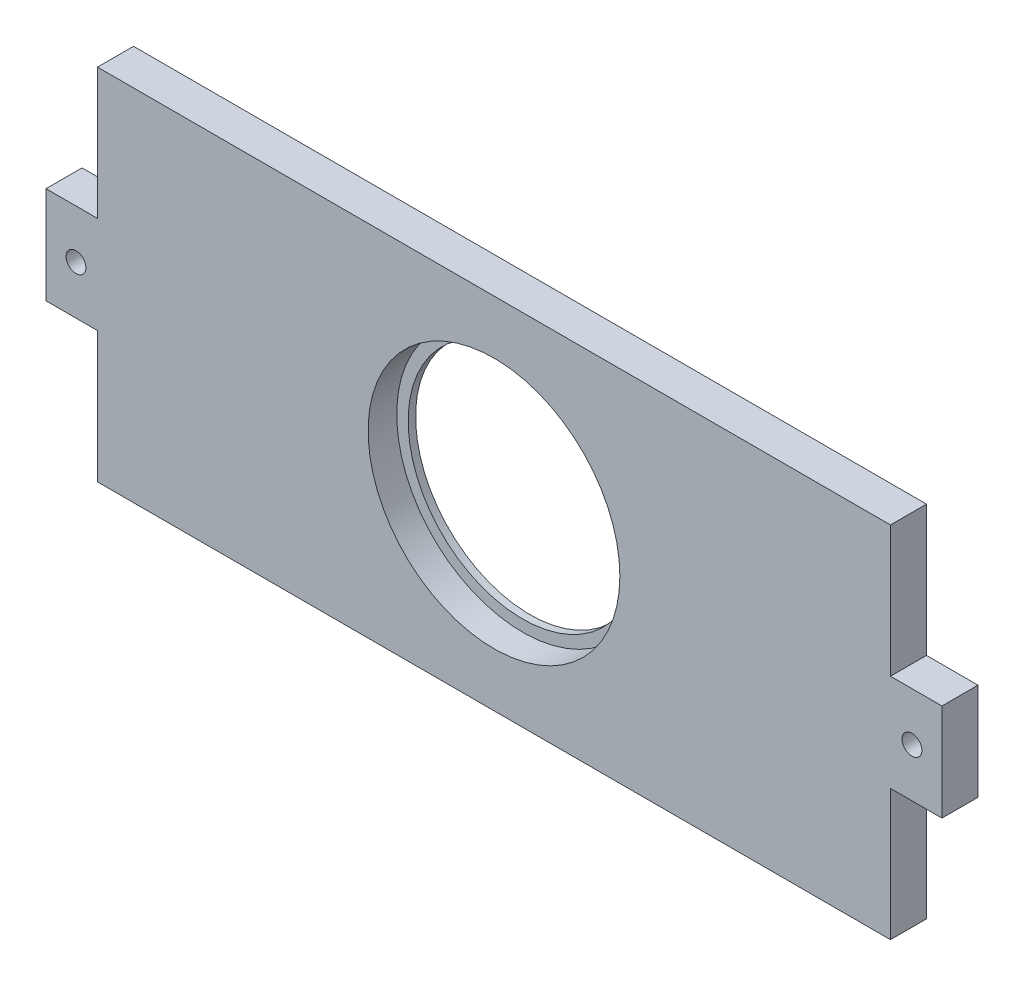
ISO-10303-21;
HEADER;
FILE_DESCRIPTION(('STEP AP214'),'2;1');
FILE_NAME('part.step','',(''),(''),'','','');
FILE_SCHEMA(('AUTOMOTIVE_DESIGN { 1 0 10303 214 1 1 1 1 }'));
ENDSEC;
DATA;
#1=APPLICATION_CONTEXT('core data for automotive mechanical design processes');
#2=APPLICATION_PROTOCOL_DEFINITION('international standard','automotive_design',2000,#1);
#3=PRODUCT_CONTEXT('',#1,'mechanical');
#4=PRODUCT('Part','Part','',(#3));
#5=PRODUCT_RELATED_PRODUCT_CATEGORY('part','',(#4));
#6=PRODUCT_DEFINITION_FORMATION('','',#4);
#7=PRODUCT_DEFINITION_CONTEXT('part definition',#1,'design');
#8=PRODUCT_DEFINITION('design','',#6,#7);
#9=PRODUCT_DEFINITION_SHAPE('','',#8);
#10=(LENGTH_UNIT() NAMED_UNIT(*) SI_UNIT(.MILLI.,.METRE.));
#11=(NAMED_UNIT(*) PLANE_ANGLE_UNIT() SI_UNIT($,.RADIAN.));
#12=(NAMED_UNIT(*) SI_UNIT($,.STERADIAN.) SOLID_ANGLE_UNIT());
#13=UNCERTAINTY_MEASURE_WITH_UNIT(LENGTH_MEASURE(1.E-05),#10,'distance_accuracy_value','');
#14=(GEOMETRIC_REPRESENTATION_CONTEXT(3) GLOBAL_UNCERTAINTY_ASSIGNED_CONTEXT((#13)) GLOBAL_UNIT_ASSIGNED_CONTEXT((#10,
#11,#12)) REPRESENTATION_CONTEXT('',''));
#15=CARTESIAN_POINT('',(0.,0.,0.));
#16=DIRECTION('',(0.,0.,1.));
#17=DIRECTION('',(1.,0.,0.));
#18=AXIS2_PLACEMENT_3D('',#15,#16,#17);
#19=CARTESIAN_POINT('',(0.,0.,4.));
#20=DIRECTION('',(0.,0.,-1.));
#21=DIRECTION('',(-1.,0.,0.));
#22=AXIS2_PLACEMENT_3D('',#19,#20,#21);
#23=CYLINDRICAL_SURFACE('',#22,12.7);
#24=CARTESIAN_POINT('',(0.,0.,0.));
#25=DIRECTION('',(0.,0.,1.));
#26=DIRECTION('',(1.,0.,0.));
#27=AXIS2_PLACEMENT_3D('',#24,#25,#26);
#28=CIRCLE('',#27,12.7);
#29=CARTESIAN_POINT('',(12.7,0.,0.));
#30=VERTEX_POINT('',#29);
#31=EDGE_CURVE('E160',#30,#30,#28,.T.);
#32=ORIENTED_EDGE('',*,*,#31,.F.);
#33=EDGE_LOOP('',(#32));
#34=FACE_BOUND('',#33,.T.);
#35=CARTESIAN_POINT('',(0.,0.,0.825));
#36=DIRECTION('',(0.,0.,1.));
#37=DIRECTION('',(1.,0.,0.));
#38=AXIS2_PLACEMENT_3D('',#35,#36,#37);
#39=CIRCLE('',#38,12.7);
#40=CARTESIAN_POINT('',(12.7,0.,0.825));
#41=VERTEX_POINT('',#40);
#42=EDGE_CURVE('E37',#41,#41,#39,.T.);
#43=ORIENTED_EDGE('',*,*,#42,.T.);
#44=EDGE_LOOP('',(#43));
#45=FACE_BOUND('',#44,.T.);
#46=ADVANCED_FACE('F33',(#34,#45),#23,.F.);
#47=CARTESIAN_POINT('',(0.,0.,4.));
#48=DIRECTION('',(0.,0.,1.));
#49=DIRECTION('',(1.,0.,0.));
#50=AXIS2_PLACEMENT_3D('',#47,#48,#49);
#51=PLANE('',#50);
#52=CARTESIAN_POINT('',(0.,0.,4.));
#53=DIRECTION('',(0.,0.,1.));
#54=DIRECTION('',(1.,0.,0.));
#55=AXIS2_PLACEMENT_3D('',#52,#53,#54);
#56=CIRCLE('',#55,13.97);
#57=CARTESIAN_POINT('',(13.97,0.,4.));
#58=VERTEX_POINT('',#57);
#59=EDGE_CURVE('E302',#58,#58,#56,.T.);
#60=ORIENTED_EDGE('',*,*,#59,.F.);
#61=EDGE_LOOP('',(#60));
#62=FACE_BOUND('',#61,.T.);
#63=CARTESIAN_POINT('',(-46.3876,0.,4.));
#64=DIRECTION('',(0.,0.,1.));
#65=DIRECTION('',(1.,0.,0.));
#66=AXIS2_PLACEMENT_3D('',#63,#64,#65);
#67=CIRCLE('',#66,1.1);
#68=CARTESIAN_POINT('',(-45.2876,0.,4.));
#69=VERTEX_POINT('',#68);
#70=EDGE_CURVE('E282',#69,#69,#67,.T.);
#71=ORIENTED_EDGE('',*,*,#70,.F.);
#72=EDGE_LOOP('',(#71));
#73=FACE_BOUND('',#72,.T.);
#74=DIRECTION('',(-1.,0.,0.));
#75=VECTOR('',#74,1.);
#76=CARTESIAN_POINT('',(44.,19.9319,4.));
#77=LINE('',#76,#75);
#78=CARTESIAN_POINT('',(44.,19.9319,4.));
#79=VERTEX_POINT('',#78);
#80=CARTESIAN_POINT('',(-44.,19.9319,4.));
#81=VERTEX_POINT('',#80);
#82=EDGE_CURVE('E179',#79,#81,#77,.T.);
#83=ORIENTED_EDGE('',*,*,#82,.T.);
#84=DIRECTION('',(0.,-1.,0.));
#85=VECTOR('',#84,1.);
#86=CARTESIAN_POINT('',(-44.,19.9319,4.));
#87=LINE('',#86,#85);
#88=CARTESIAN_POINT('',(-44.,5.39,4.));
#89=VERTEX_POINT('',#88);
#90=EDGE_CURVE('E106',#81,#89,#87,.T.);
#91=ORIENTED_EDGE('',*,*,#90,.T.);
#92=DIRECTION('',(-1.,0.,0.));
#93=VECTOR('',#92,1.);
#94=CARTESIAN_POINT('',(-44.,5.39,4.));
#95=LINE('',#94,#93);
#96=CARTESIAN_POINT('',(-49.715,5.39,4.));
#97=VERTEX_POINT('',#96);
#98=EDGE_CURVE('E207',#89,#97,#95,.T.);
#99=ORIENTED_EDGE('',*,*,#98,.T.);
#100=DIRECTION('',(0.,-1.,0.));
#101=VECTOR('',#100,1.);
#102=CARTESIAN_POINT('',(-49.715,5.39,4.));
#103=LINE('',#102,#101);
#104=CARTESIAN_POINT('',(-49.715,-5.39,4.));
#105=VERTEX_POINT('',#104);
#106=EDGE_CURVE('E226',#97,#105,#103,.T.);
#107=ORIENTED_EDGE('',*,*,#106,.T.);
#108=DIRECTION('',(1.,0.,0.));
#109=VECTOR('',#108,1.);
#110=CARTESIAN_POINT('',(-44.,-5.39,4.));
#111=LINE('',#110,#109);
#112=CARTESIAN_POINT('',(-44.,-5.39,4.));
#113=VERTEX_POINT('',#112);
#114=EDGE_CURVE('E223',#105,#113,#111,.T.);
#115=ORIENTED_EDGE('',*,*,#114,.T.);
#116=DIRECTION('',(0.,-1.,0.));
#117=VECTOR('',#116,1.);
#118=CARTESIAN_POINT('',(-44.,-19.9319,4.));
#119=LINE('',#118,#117);
#120=CARTESIAN_POINT('',(-44.,-19.9319,4.));
#121=VERTEX_POINT('',#120);
#122=EDGE_CURVE('E225',#113,#121,#119,.T.);
#123=ORIENTED_EDGE('',*,*,#122,.T.);
#124=DIRECTION('',(1.,0.,0.));
#125=VECTOR('',#124,1.);
#126=CARTESIAN_POINT('',(44.,-19.9319,4.));
#127=LINE('',#126,#125);
#128=CARTESIAN_POINT('',(44.,-19.9319,4.));
#129=VERTEX_POINT('',#128);
#130=EDGE_CURVE('E228',#121,#129,#127,.T.);
#131=ORIENTED_EDGE('',*,*,#130,.T.);
#132=DIRECTION('',(0.,1.,0.));
#133=VECTOR('',#132,1.);
#134=CARTESIAN_POINT('',(44.,-19.9319,4.));
#135=LINE('',#134,#133);
#136=CARTESIAN_POINT('',(44.,-5.39,4.));
#137=VERTEX_POINT('',#136);
#138=EDGE_CURVE('E234',#129,#137,#135,.T.);
#139=ORIENTED_EDGE('',*,*,#138,.T.);
#140=DIRECTION('',(1.,0.,0.));
#141=VECTOR('',#140,1.);
#142=CARTESIAN_POINT('',(44.,-5.39,4.));
#143=LINE('',#142,#141);
#144=CARTESIAN_POINT('',(49.715,-5.39,4.));
#145=VERTEX_POINT('',#144);
#146=EDGE_CURVE('E138',#137,#145,#143,.T.);
#147=ORIENTED_EDGE('',*,*,#146,.T.);
#148=DIRECTION('',(0.,1.,0.));
#149=VECTOR('',#148,1.);
#150=CARTESIAN_POINT('',(49.715,5.39,4.));
#151=LINE('',#150,#149);
#152=CARTESIAN_POINT('',(49.715,5.39,4.));
#153=VERTEX_POINT('',#152);
#154=EDGE_CURVE('E131',#145,#153,#151,.T.);
#155=ORIENTED_EDGE('',*,*,#154,.T.);
#156=DIRECTION('',(-1.,0.,0.));
#157=VECTOR('',#156,1.);
#158=CARTESIAN_POINT('',(44.,5.39,4.));
#159=LINE('',#158,#157);
#160=CARTESIAN_POINT('',(44.,5.39,4.));
#161=VERTEX_POINT('',#160);
#162=EDGE_CURVE('E136',#153,#161,#159,.T.);
#163=ORIENTED_EDGE('',*,*,#162,.T.);
#164=DIRECTION('',(0.,1.,0.));
#165=VECTOR('',#164,1.);
#166=CARTESIAN_POINT('',(44.,19.9319,4.));
#167=LINE('',#166,#165);
#168=EDGE_CURVE('E51',#161,#79,#167,.T.);
#169=ORIENTED_EDGE('',*,*,#168,.T.);
#170=EDGE_LOOP('',(#83,#91,#99,#107,#115,#123,#131,#139,#147,#155,#163,#169));
#171=FACE_BOUND('',#170,.T.);
#172=CARTESIAN_POINT('',(46.3876,0.,4.));
#173=DIRECTION('',(0.,0.,1.));
#174=DIRECTION('',(-1.,0.,0.));
#175=AXIS2_PLACEMENT_3D('',#172,#173,#174);
#176=CIRCLE('',#175,1.1);
#177=CARTESIAN_POINT('',(45.2876,0.,4.));
#178=VERTEX_POINT('',#177);
#179=EDGE_CURVE('E283',#178,#178,#176,.T.);
#180=ORIENTED_EDGE('',*,*,#179,.F.);
#181=EDGE_LOOP('',(#180));
#182=FACE_BOUND('',#181,.T.);
#183=ADVANCED_FACE('F133',(#62,#73,#171,#182),#51,.T.);
#184=CARTESIAN_POINT('',(0.,0.,0.));
#185=DIRECTION('',(0.,0.,1.));
#186=DIRECTION('',(1.,0.,0.));
#187=AXIS2_PLACEMENT_3D('',#184,#185,#186);
#188=PLANE('',#187);
#189=CARTESIAN_POINT('',(-46.3876,0.,0.));
#190=DIRECTION('',(0.,0.,1.));
#191=DIRECTION('',(1.,0.,0.));
#192=AXIS2_PLACEMENT_3D('',#189,#190,#191);
#193=CIRCLE('',#192,1.1);
#194=CARTESIAN_POINT('',(-45.2876,0.,0.));
#195=VERTEX_POINT('',#194);
#196=EDGE_CURVE('E280',#195,#195,#193,.T.);
#197=ORIENTED_EDGE('',*,*,#196,.T.);
#198=EDGE_LOOP('',(#197));
#199=FACE_BOUND('',#198,.T.);
#200=DIRECTION('',(-1.,0.,0.));
#201=VECTOR('',#200,1.);
#202=CARTESIAN_POINT('',(44.,19.9319,0.));
#203=LINE('',#202,#201);
#204=CARTESIAN_POINT('',(44.,19.9319,0.));
#205=VERTEX_POINT('',#204);
#206=CARTESIAN_POINT('',(-44.,19.9319,0.));
#207=VERTEX_POINT('',#206);
#208=EDGE_CURVE('E156',#205,#207,#203,.T.);
#209=ORIENTED_EDGE('',*,*,#208,.F.);
#210=DIRECTION('',(0.,1.,0.));
#211=VECTOR('',#210,1.);
#212=CARTESIAN_POINT('',(44.,19.9319,0.));
#213=LINE('',#212,#211);
#214=CARTESIAN_POINT('',(44.,5.39,0.));
#215=VERTEX_POINT('',#214);
#216=EDGE_CURVE('E98',#215,#205,#213,.T.);
#217=ORIENTED_EDGE('',*,*,#216,.F.);
#218=DIRECTION('',(-1.,0.,0.));
#219=VECTOR('',#218,1.);
#220=CARTESIAN_POINT('',(44.,5.39,0.));
#221=LINE('',#220,#219);
#222=CARTESIAN_POINT('',(49.715,5.39,0.));
#223=VERTEX_POINT('',#222);
#224=EDGE_CURVE('E92',#223,#215,#221,.T.);
#225=ORIENTED_EDGE('',*,*,#224,.F.);
#226=DIRECTION('',(0.,1.,0.));
#227=VECTOR('',#226,1.);
#228=CARTESIAN_POINT('',(49.715,5.39,0.));
#229=LINE('',#228,#227);
#230=CARTESIAN_POINT('',(49.715,-5.39,0.));
#231=VERTEX_POINT('',#230);
#232=EDGE_CURVE('E146',#231,#223,#229,.T.);
#233=ORIENTED_EDGE('',*,*,#232,.F.);
#234=DIRECTION('',(1.,0.,0.));
#235=VECTOR('',#234,1.);
#236=CARTESIAN_POINT('',(44.,-5.39,0.));
#237=LINE('',#236,#235);
#238=CARTESIAN_POINT('',(44.,-5.39,0.));
#239=VERTEX_POINT('',#238);
#240=EDGE_CURVE('E174',#239,#231,#237,.T.);
#241=ORIENTED_EDGE('',*,*,#240,.F.);
#242=DIRECTION('',(0.,1.,0.));
#243=VECTOR('',#242,1.);
#244=CARTESIAN_POINT('',(44.,-19.9319,0.));
#245=LINE('',#244,#243);
#246=CARTESIAN_POINT('',(44.,-19.9319,0.));
#247=VERTEX_POINT('',#246);
#248=EDGE_CURVE('E172',#247,#239,#245,.T.);
#249=ORIENTED_EDGE('',*,*,#248,.F.);
#250=DIRECTION('',(1.,0.,0.));
#251=VECTOR('',#250,1.);
#252=CARTESIAN_POINT('',(44.,-19.9319,0.));
#253=LINE('',#252,#251);
#254=CARTESIAN_POINT('',(-44.,-19.9319,0.));
#255=VERTEX_POINT('',#254);
#256=EDGE_CURVE('E170',#255,#247,#253,.T.);
#257=ORIENTED_EDGE('',*,*,#256,.F.);
#258=DIRECTION('',(0.,-1.,0.));
#259=VECTOR('',#258,1.);
#260=CARTESIAN_POINT('',(-44.,-19.9319,0.));
#261=LINE('',#260,#259);
#262=CARTESIAN_POINT('',(-44.,-5.39,0.));
#263=VERTEX_POINT('',#262);
#264=EDGE_CURVE('E168',#263,#255,#261,.T.);
#265=ORIENTED_EDGE('',*,*,#264,.F.);
#266=DIRECTION('',(1.,0.,0.));
#267=VECTOR('',#266,1.);
#268=CARTESIAN_POINT('',(-44.,-5.39,0.));
#269=LINE('',#268,#267);
#270=CARTESIAN_POINT('',(-49.715,-5.39,0.));
#271=VERTEX_POINT('',#270);
#272=EDGE_CURVE('E166',#271,#263,#269,.T.);
#273=ORIENTED_EDGE('',*,*,#272,.F.);
#274=DIRECTION('',(0.,-1.,0.));
#275=VECTOR('',#274,1.);
#276=CARTESIAN_POINT('',(-49.715,5.39,0.));
#277=LINE('',#276,#275);
#278=CARTESIAN_POINT('',(-49.715,5.39,0.));
#279=VERTEX_POINT('',#278);
#280=EDGE_CURVE('E164',#279,#271,#277,.T.);
#281=ORIENTED_EDGE('',*,*,#280,.F.);
#282=DIRECTION('',(-1.,0.,0.));
#283=VECTOR('',#282,1.);
#284=CARTESIAN_POINT('',(-44.,5.39,0.));
#285=LINE('',#284,#283);
#286=CARTESIAN_POINT('',(-44.,5.39,0.));
#287=VERTEX_POINT('',#286);
#288=EDGE_CURVE('E162',#287,#279,#285,.T.);
#289=ORIENTED_EDGE('',*,*,#288,.F.);
#290=DIRECTION('',(0.,-1.,0.));
#291=VECTOR('',#290,1.);
#292=CARTESIAN_POINT('',(-44.,19.9319,0.));
#293=LINE('',#292,#291);
#294=EDGE_CURVE('E159',#207,#287,#293,.T.);
#295=ORIENTED_EDGE('',*,*,#294,.F.);
#296=EDGE_LOOP('',(#209,#217,#225,#233,#241,#249,#257,#265,#273,#281,#289,#295));
#297=FACE_BOUND('',#296,.T.);
#298=ORIENTED_EDGE('',*,*,#31,.T.);
#299=EDGE_LOOP('',(#298));
#300=FACE_BOUND('',#299,.T.);
#301=CARTESIAN_POINT('',(46.3876,0.,0.));
#302=DIRECTION('',(0.,0.,1.));
#303=DIRECTION('',(-1.,0.,0.));
#304=AXIS2_PLACEMENT_3D('',#301,#302,#303);
#305=CIRCLE('',#304,1.1);
#306=CARTESIAN_POINT('',(45.2876,0.,0.));
#307=VERTEX_POINT('',#306);
#308=EDGE_CURVE('E288',#307,#307,#305,.T.);
#309=ORIENTED_EDGE('',*,*,#308,.T.);
#310=EDGE_LOOP('',(#309));
#311=FACE_BOUND('',#310,.T.);
#312=ADVANCED_FACE('F211',(#199,#297,#300,#311),#188,.F.);
#313=CARTESIAN_POINT('',(44.,19.9319,4.));
#314=DIRECTION('',(0.,-1.,0.));
#315=DIRECTION('',(1.,0.,0.));
#316=AXIS2_PLACEMENT_3D('',#313,#314,#315);
#317=PLANE('',#316);
#318=ORIENTED_EDGE('',*,*,#208,.T.);
#319=DIRECTION('',(0.,0.,-1.));
#320=VECTOR('',#319,1.);
#321=CARTESIAN_POINT('',(-44.,19.9319,4.));
#322=LINE('',#321,#320);
#323=EDGE_CURVE('E11',#81,#207,#322,.T.);
#324=ORIENTED_EDGE('',*,*,#323,.F.);
#325=ORIENTED_EDGE('',*,*,#82,.F.);
#326=DIRECTION('',(0.,0.,-1.));
#327=VECTOR('',#326,1.);
#328=CARTESIAN_POINT('',(44.,19.9319,4.));
#329=LINE('',#328,#327);
#330=EDGE_CURVE('E152',#79,#205,#329,.T.);
#331=ORIENTED_EDGE('',*,*,#330,.T.);
#332=EDGE_LOOP('',(#318,#324,#325,#331));
#333=FACE_BOUND('',#332,.T.);
#334=ADVANCED_FACE('F35',(#333),#317,.F.);
#335=CARTESIAN_POINT('',(-44.,19.9319,4.));
#336=DIRECTION('',(1.,0.,0.));
#337=DIRECTION('',(0.,0.,-1.));
#338=AXIS2_PLACEMENT_3D('',#335,#336,#337);
#339=PLANE('',#338);
#340=ORIENTED_EDGE('',*,*,#294,.T.);
#341=DIRECTION('',(0.,0.,-1.));
#342=VECTOR('',#341,1.);
#343=CARTESIAN_POINT('',(-44.,5.39,4.));
#344=LINE('',#343,#342);
#345=EDGE_CURVE('E43',#89,#287,#344,.T.);
#346=ORIENTED_EDGE('',*,*,#345,.F.);
#347=ORIENTED_EDGE('',*,*,#90,.F.);
#348=ORIENTED_EDGE('',*,*,#323,.T.);
#349=EDGE_LOOP('',(#340,#346,#347,#348));
#350=FACE_BOUND('',#349,.T.);
#351=ADVANCED_FACE('F277',(#350),#339,.F.);
#352=CARTESIAN_POINT('',(-44.,5.39,4.));
#353=DIRECTION('',(0.,-1.,0.));
#354=DIRECTION('',(1.,0.,0.));
#355=AXIS2_PLACEMENT_3D('',#352,#353,#354);
#356=PLANE('',#355);
#357=ORIENTED_EDGE('',*,*,#288,.T.);
#358=DIRECTION('',(0.,0.,-1.));
#359=VECTOR('',#358,1.);
#360=CARTESIAN_POINT('',(-49.715,5.39,4.));
#361=LINE('',#360,#359);
#362=EDGE_CURVE('E198',#97,#279,#361,.T.);
#363=ORIENTED_EDGE('',*,*,#362,.F.);
#364=ORIENTED_EDGE('',*,*,#98,.F.);
#365=ORIENTED_EDGE('',*,*,#345,.T.);
#366=EDGE_LOOP('',(#357,#363,#364,#365));
#367=FACE_BOUND('',#366,.T.);
#368=ADVANCED_FACE('F205',(#367),#356,.F.);
#369=CARTESIAN_POINT('',(-49.715,5.39,4.));
#370=DIRECTION('',(1.,0.,0.));
#371=DIRECTION('',(0.,0.,-1.));
#372=AXIS2_PLACEMENT_3D('',#369,#370,#371);
#373=PLANE('',#372);
#374=ORIENTED_EDGE('',*,*,#280,.T.);
#375=DIRECTION('',(0.,0.,-1.));
#376=VECTOR('',#375,1.);
#377=CARTESIAN_POINT('',(-49.715,-5.39,4.));
#378=LINE('',#377,#376);
#379=EDGE_CURVE('E195',#105,#271,#378,.T.);
#380=ORIENTED_EDGE('',*,*,#379,.F.);
#381=ORIENTED_EDGE('',*,*,#106,.F.);
#382=ORIENTED_EDGE('',*,*,#362,.T.);
#383=EDGE_LOOP('',(#374,#380,#381,#382));
#384=FACE_BOUND('',#383,.T.);
#385=ADVANCED_FACE('F217',(#384),#373,.F.);
#386=CARTESIAN_POINT('',(-44.,-5.39,4.));
#387=DIRECTION('',(0.,1.,0.));
#388=DIRECTION('',(-1.,0.,0.));
#389=AXIS2_PLACEMENT_3D('',#386,#387,#388);
#390=PLANE('',#389);
#391=ORIENTED_EDGE('',*,*,#272,.T.);
#392=DIRECTION('',(0.,0.,-1.));
#393=VECTOR('',#392,1.);
#394=CARTESIAN_POINT('',(-44.,-5.39,4.));
#395=LINE('',#394,#393);
#396=EDGE_CURVE('E192',#113,#263,#395,.T.);
#397=ORIENTED_EDGE('',*,*,#396,.F.);
#398=ORIENTED_EDGE('',*,*,#114,.F.);
#399=ORIENTED_EDGE('',*,*,#379,.T.);
#400=EDGE_LOOP('',(#391,#397,#398,#399));
#401=FACE_BOUND('',#400,.T.);
#402=ADVANCED_FACE('F221',(#401),#390,.F.);
#403=CARTESIAN_POINT('',(-44.,-19.9319,4.));
#404=DIRECTION('',(1.,0.,0.));
#405=DIRECTION('',(0.,0.,-1.));
#406=AXIS2_PLACEMENT_3D('',#403,#404,#405);
#407=PLANE('',#406);
#408=ORIENTED_EDGE('',*,*,#264,.T.);
#409=DIRECTION('',(0.,0.,-1.));
#410=VECTOR('',#409,1.);
#411=CARTESIAN_POINT('',(-44.,-19.9319,4.));
#412=LINE('',#411,#410);
#413=EDGE_CURVE('E189',#121,#255,#412,.T.);
#414=ORIENTED_EDGE('',*,*,#413,.F.);
#415=ORIENTED_EDGE('',*,*,#122,.F.);
#416=ORIENTED_EDGE('',*,*,#396,.T.);
#417=EDGE_LOOP('',(#408,#414,#415,#416));
#418=FACE_BOUND('',#417,.T.);
#419=ADVANCED_FACE('F375',(#418),#407,.F.);
#420=CARTESIAN_POINT('',(44.,-19.9319,4.));
#421=DIRECTION('',(0.,1.,0.));
#422=DIRECTION('',(-1.,0.,0.));
#423=AXIS2_PLACEMENT_3D('',#420,#421,#422);
#424=PLANE('',#423);
#425=ORIENTED_EDGE('',*,*,#256,.T.);
#426=DIRECTION('',(0.,0.,-1.));
#427=VECTOR('',#426,1.);
#428=CARTESIAN_POINT('',(44.,-19.9319,4.));
#429=LINE('',#428,#427);
#430=EDGE_CURVE('E186',#129,#247,#429,.T.);
#431=ORIENTED_EDGE('',*,*,#430,.F.);
#432=ORIENTED_EDGE('',*,*,#130,.F.);
#433=ORIENTED_EDGE('',*,*,#413,.T.);
#434=EDGE_LOOP('',(#425,#431,#432,#433));
#435=FACE_BOUND('',#434,.T.);
#436=ADVANCED_FACE('F366',(#435),#424,.F.);
#437=CARTESIAN_POINT('',(44.,-19.9319,4.));
#438=DIRECTION('',(-1.,0.,0.));
#439=DIRECTION('',(0.,0.,1.));
#440=AXIS2_PLACEMENT_3D('',#437,#438,#439);
#441=PLANE('',#440);
#442=ORIENTED_EDGE('',*,*,#248,.T.);
#443=DIRECTION('',(0.,0.,-1.));
#444=VECTOR('',#443,1.);
#445=CARTESIAN_POINT('',(44.,-5.39,4.));
#446=LINE('',#445,#444);
#447=EDGE_CURVE('E183',#137,#239,#446,.T.);
#448=ORIENTED_EDGE('',*,*,#447,.F.);
#449=ORIENTED_EDGE('',*,*,#138,.F.);
#450=ORIENTED_EDGE('',*,*,#430,.T.);
#451=EDGE_LOOP('',(#442,#448,#449,#450));
#452=FACE_BOUND('',#451,.T.);
#453=ADVANCED_FACE('F240',(#452),#441,.F.);
#454=CARTESIAN_POINT('',(44.,-5.39,4.));
#455=DIRECTION('',(0.,1.,0.));
#456=DIRECTION('',(-1.,0.,0.));
#457=AXIS2_PLACEMENT_3D('',#454,#455,#456);
#458=PLANE('',#457);
#459=ORIENTED_EDGE('',*,*,#240,.T.);
#460=DIRECTION('',(0.,0.,-1.));
#461=VECTOR('',#460,1.);
#462=CARTESIAN_POINT('',(49.715,-5.39,4.));
#463=LINE('',#462,#461);
#464=EDGE_CURVE('E147',#145,#231,#463,.T.);
#465=ORIENTED_EDGE('',*,*,#464,.F.);
#466=ORIENTED_EDGE('',*,*,#146,.F.);
#467=ORIENTED_EDGE('',*,*,#447,.T.);
#468=EDGE_LOOP('',(#459,#465,#466,#467));
#469=FACE_BOUND('',#468,.T.);
#470=ADVANCED_FACE('F244',(#469),#458,.F.);
#471=CARTESIAN_POINT('',(49.715,5.39,4.));
#472=DIRECTION('',(-1.,0.,0.));
#473=DIRECTION('',(0.,0.,1.));
#474=AXIS2_PLACEMENT_3D('',#471,#472,#473);
#475=PLANE('',#474);
#476=ORIENTED_EDGE('',*,*,#232,.T.);
#477=DIRECTION('',(0.,0.,-1.));
#478=VECTOR('',#477,1.);
#479=CARTESIAN_POINT('',(49.715,5.39,4.));
#480=LINE('',#479,#478);
#481=EDGE_CURVE('E143',#153,#223,#480,.T.);
#482=ORIENTED_EDGE('',*,*,#481,.F.);
#483=ORIENTED_EDGE('',*,*,#154,.F.);
#484=ORIENTED_EDGE('',*,*,#464,.T.);
#485=EDGE_LOOP('',(#476,#482,#483,#484));
#486=FACE_BOUND('',#485,.T.);
#487=ADVANCED_FACE('F144',(#486),#475,.F.);
#488=CARTESIAN_POINT('',(44.,5.39,4.));
#489=DIRECTION('',(0.,-1.,0.));
#490=DIRECTION('',(1.,0.,0.));
#491=AXIS2_PLACEMENT_3D('',#488,#489,#490);
#492=PLANE('',#491);
#493=ORIENTED_EDGE('',*,*,#224,.T.);
#494=DIRECTION('',(0.,0.,-1.));
#495=VECTOR('',#494,1.);
#496=CARTESIAN_POINT('',(44.,5.39,4.));
#497=LINE('',#496,#495);
#498=EDGE_CURVE('E148',#161,#215,#497,.T.);
#499=ORIENTED_EDGE('',*,*,#498,.F.);
#500=ORIENTED_EDGE('',*,*,#162,.F.);
#501=ORIENTED_EDGE('',*,*,#481,.T.);
#502=EDGE_LOOP('',(#493,#499,#500,#501));
#503=FACE_BOUND('',#502,.T.);
#504=ADVANCED_FACE('F150',(#503),#492,.F.);
#505=CARTESIAN_POINT('',(44.,19.9319,4.));
#506=DIRECTION('',(-1.,0.,0.));
#507=DIRECTION('',(0.,0.,1.));
#508=AXIS2_PLACEMENT_3D('',#505,#506,#507);
#509=PLANE('',#508);
#510=ORIENTED_EDGE('',*,*,#216,.T.);
#511=ORIENTED_EDGE('',*,*,#330,.F.);
#512=ORIENTED_EDGE('',*,*,#168,.F.);
#513=ORIENTED_EDGE('',*,*,#498,.T.);
#514=EDGE_LOOP('',(#510,#511,#512,#513));
#515=FACE_BOUND('',#514,.T.);
#516=ADVANCED_FACE('F248',(#515),#509,.F.);
#517=CARTESIAN_POINT('',(-46.3876,0.,4.));
#518=DIRECTION('',(0.,0.,-1.));
#519=DIRECTION('',(-1.,0.,0.));
#520=AXIS2_PLACEMENT_3D('',#517,#518,#519);
#521=CYLINDRICAL_SURFACE('',#520,1.1);
#522=ORIENTED_EDGE('',*,*,#70,.T.);
#523=EDGE_LOOP('',(#522));
#524=FACE_BOUND('',#523,.T.);
#525=ORIENTED_EDGE('',*,*,#196,.F.);
#526=EDGE_LOOP('',(#525));
#527=FACE_BOUND('',#526,.T.);
#528=ADVANCED_FACE('F250',(#524,#527),#521,.F.);
#529=CARTESIAN_POINT('',(46.3876,0.,4.));
#530=DIRECTION('',(0.,0.,-1.));
#531=DIRECTION('',(-1.,0.,0.));
#532=AXIS2_PLACEMENT_3D('',#529,#530,#531);
#533=CYLINDRICAL_SURFACE('',#532,1.1);
#534=ORIENTED_EDGE('',*,*,#179,.T.);
#535=EDGE_LOOP('',(#534));
#536=FACE_BOUND('',#535,.T.);
#537=ORIENTED_EDGE('',*,*,#308,.F.);
#538=EDGE_LOOP('',(#537));
#539=FACE_BOUND('',#538,.T.);
#540=ADVANCED_FACE('F256',(#536,#539),#533,.F.);
#541=CARTESIAN_POINT('',(0.,0.,0.825));
#542=DIRECTION('',(0.,0.,1.));
#543=DIRECTION('',(1.,0.,0.));
#544=AXIS2_PLACEMENT_3D('',#541,#542,#543);
#545=CYLINDRICAL_SURFACE('',#544,13.97);
#546=CARTESIAN_POINT('',(0.,0.,0.825));
#547=DIRECTION('',(0.,0.,1.));
#548=DIRECTION('',(1.,0.,0.));
#549=AXIS2_PLACEMENT_3D('',#546,#547,#548);
#550=CIRCLE('',#549,13.97);
#551=CARTESIAN_POINT('',(13.97,0.,0.825));
#552=VERTEX_POINT('',#551);
#553=EDGE_CURVE('E300',#552,#552,#550,.T.);
#554=ORIENTED_EDGE('',*,*,#553,.F.);
#555=EDGE_LOOP('',(#554));
#556=FACE_BOUND('',#555,.T.);
#557=ORIENTED_EDGE('',*,*,#59,.T.);
#558=EDGE_LOOP('',(#557));
#559=FACE_BOUND('',#558,.T.);
#560=ADVANCED_FACE('F310',(#556,#559),#545,.F.);
#561=CARTESIAN_POINT('',(0.,0.,0.825));
#562=DIRECTION('',(0.,0.,1.));
#563=DIRECTION('',(1.,0.,0.));
#564=AXIS2_PLACEMENT_3D('',#561,#562,#563);
#565=PLANE('',#564);
#566=ORIENTED_EDGE('',*,*,#42,.F.);
#567=EDGE_LOOP('',(#566));
#568=FACE_BOUND('',#567,.T.);
#569=ORIENTED_EDGE('',*,*,#553,.T.);
#570=EDGE_LOOP('',(#569));
#571=FACE_BOUND('',#570,.T.);
#572=ADVANCED_FACE('F308',(#568,#571),#565,.T.);
#573=CLOSED_SHELL('',(#46,#183,#312,#334,#351,#368,#385,#402,#419,#436,#453,#470,#487,#504,#516,
#528,#540,#560,#572));
#574=MANIFOLD_SOLID_BREP('B2',#573);
#575=ADVANCED_BREP_SHAPE_REPRESENTATION('',(#18,#574),#14);
#576=SHAPE_DEFINITION_REPRESENTATION(#9,#575);
ENDSEC;
END-ISO-10303-21;
